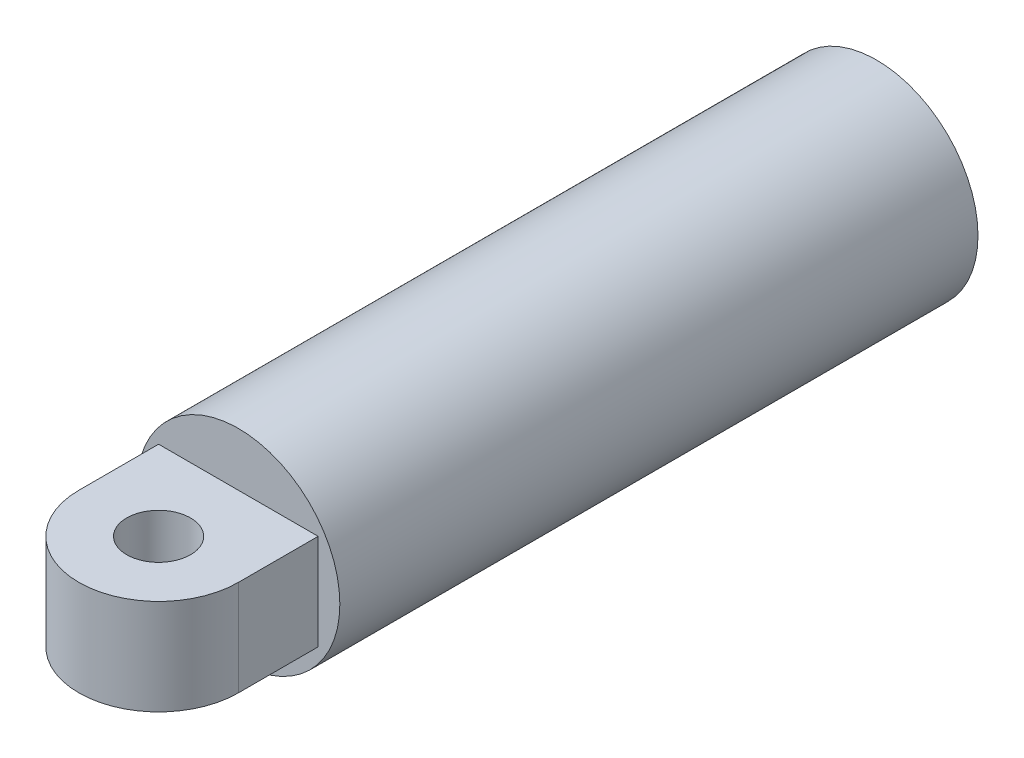
ISO-10303-21;
HEADER;
FILE_DESCRIPTION(('STEP AP214'),'2;1');
FILE_NAME('part.step','',(''),(''),'','','');
FILE_SCHEMA(('AUTOMOTIVE_DESIGN { 1 0 10303 214 1 1 1 1 }'));
ENDSEC;
DATA;
#1=APPLICATION_CONTEXT('core data for automotive mechanical design processes');
#2=APPLICATION_PROTOCOL_DEFINITION('international standard','automotive_design',2000,#1);
#3=PRODUCT_CONTEXT('',#1,'mechanical');
#4=PRODUCT('Part','Part','',(#3));
#5=PRODUCT_RELATED_PRODUCT_CATEGORY('part','',(#4));
#6=PRODUCT_DEFINITION_FORMATION('','',#4);
#7=PRODUCT_DEFINITION_CONTEXT('part definition',#1,'design');
#8=PRODUCT_DEFINITION('design','',#6,#7);
#9=PRODUCT_DEFINITION_SHAPE('','',#8);
#10=(LENGTH_UNIT() NAMED_UNIT(*) SI_UNIT(.MILLI.,.METRE.));
#11=(NAMED_UNIT(*) PLANE_ANGLE_UNIT() SI_UNIT($,.RADIAN.));
#12=(NAMED_UNIT(*) SI_UNIT($,.STERADIAN.) SOLID_ANGLE_UNIT());
#13=UNCERTAINTY_MEASURE_WITH_UNIT(LENGTH_MEASURE(1.E-05),#10,'distance_accuracy_value','');
#14=(GEOMETRIC_REPRESENTATION_CONTEXT(3) GLOBAL_UNCERTAINTY_ASSIGNED_CONTEXT((#13)) GLOBAL_UNIT_ASSIGNED_CONTEXT((#10,
#11,#12)) REPRESENTATION_CONTEXT('',''));
#15=CARTESIAN_POINT('',(0.,0.,0.));
#16=DIRECTION('',(0.,0.,1.));
#17=DIRECTION('',(1.,0.,0.));
#18=AXIS2_PLACEMENT_3D('',#15,#16,#17);
#19=CARTESIAN_POINT('',(12.5,7.5,125.));
#20=DIRECTION('',(-1.,0.,0.));
#21=DIRECTION('',(0.,0.,1.));
#22=AXIS2_PLACEMENT_3D('',#19,#20,#21);
#23=PLANE('',#22);
#24=DIRECTION('',(0.,-1.,0.));
#25=VECTOR('',#24,1.);
#26=CARTESIAN_POINT('',(12.5,15.9,112.5));
#27=LINE('',#26,#25);
#28=CARTESIAN_POINT('',(12.5,7.5,112.5));
#29=VERTEX_POINT('',#28);
#30=CARTESIAN_POINT('',(12.5,-7.5,112.5));
#31=VERTEX_POINT('',#30);
#32=EDGE_CURVE('E77',#29,#31,#27,.T.);
#33=ORIENTED_EDGE('',*,*,#32,.T.);
#34=DIRECTION('',(0.,0.,-1.));
#35=VECTOR('',#34,1.);
#36=CARTESIAN_POINT('',(12.5,-7.5,125.));
#37=LINE('',#36,#35);
#38=CARTESIAN_POINT('',(12.5,-7.5,100.));
#39=VERTEX_POINT('',#38);
#40=EDGE_CURVE('E56',#31,#39,#37,.T.);
#41=ORIENTED_EDGE('',*,*,#40,.T.);
#42=DIRECTION('',(0.,1.,0.));
#43=VECTOR('',#42,1.);
#44=CARTESIAN_POINT('',(12.5,7.5,100.));
#45=LINE('',#44,#43);
#46=CARTESIAN_POINT('',(12.5,7.5,100.));
#47=VERTEX_POINT('',#46);
#48=EDGE_CURVE('E142',#39,#47,#45,.T.);
#49=ORIENTED_EDGE('',*,*,#48,.T.);
#50=DIRECTION('',(0.,0.,-1.));
#51=VECTOR('',#50,1.);
#52=CARTESIAN_POINT('',(12.5,7.5,125.));
#53=LINE('',#52,#51);
#54=EDGE_CURVE('E94',#29,#47,#53,.T.);
#55=ORIENTED_EDGE('',*,*,#54,.F.);
#56=EDGE_LOOP('',(#33,#41,#49,#55));
#57=FACE_BOUND('',#56,.T.);
#58=ADVANCED_FACE('F33',(#57),#23,.F.);
#59=CARTESIAN_POINT('',(-12.5,7.5,125.));
#60=DIRECTION('',(0.,-1.,0.));
#61=DIRECTION('',(1.,0.,0.));
#62=AXIS2_PLACEMENT_3D('',#59,#60,#61);
#63=PLANE('',#62);
#64=CARTESIAN_POINT('',(0.,7.5,112.5));
#65=DIRECTION('',(0.,-1.,0.));
#66=DIRECTION('',(1.,0.,0.));
#67=AXIS2_PLACEMENT_3D('',#64,#65,#66);
#68=CIRCLE('',#67,5.00000000000001);
#69=CARTESIAN_POINT('',(5.00000000000001,7.5,112.5));
#70=VERTEX_POINT('',#69);
#71=EDGE_CURVE('E145',#70,#70,#68,.F.);
#72=ORIENTED_EDGE('',*,*,#71,.F.);
#73=EDGE_LOOP('',(#72));
#74=FACE_BOUND('',#73,.T.);
#75=CARTESIAN_POINT('',(0.,7.5,112.5));
#76=DIRECTION('',(0.,-1.,0.));
#77=DIRECTION('',(1.,0.,0.));
#78=AXIS2_PLACEMENT_3D('',#75,#76,#77);
#79=CIRCLE('',#78,12.5);
#80=CARTESIAN_POINT('',(-12.5,7.5,112.5));
#81=VERTEX_POINT('',#80);
#82=EDGE_CURVE('E84',#29,#81,#79,.T.);
#83=ORIENTED_EDGE('',*,*,#82,.F.);
#84=ORIENTED_EDGE('',*,*,#54,.T.);
#85=DIRECTION('',(-1.,0.,0.));
#86=VECTOR('',#85,1.);
#87=CARTESIAN_POINT('',(-12.5,7.5,100.));
#88=LINE('',#87,#86);
#89=CARTESIAN_POINT('',(-12.5,7.5,100.));
#90=VERTEX_POINT('',#89);
#91=EDGE_CURVE('E141',#47,#90,#88,.T.);
#92=ORIENTED_EDGE('',*,*,#91,.T.);
#93=DIRECTION('',(0.,0.,-1.));
#94=VECTOR('',#93,1.);
#95=CARTESIAN_POINT('',(-12.5,7.5,125.));
#96=LINE('',#95,#94);
#97=EDGE_CURVE('E92',#81,#90,#96,.T.);
#98=ORIENTED_EDGE('',*,*,#97,.F.);
#99=EDGE_LOOP('',(#83,#84,#92,#98));
#100=FACE_BOUND('',#99,.T.);
#101=ADVANCED_FACE('F122',(#74,#100),#63,.F.);
#102=CARTESIAN_POINT('',(-12.5,7.5,125.));
#103=DIRECTION('',(1.,0.,0.));
#104=DIRECTION('',(0.,0.,-1.));
#105=AXIS2_PLACEMENT_3D('',#102,#103,#104);
#106=PLANE('',#105);
#107=DIRECTION('',(0.,-1.,0.));
#108=VECTOR('',#107,1.);
#109=CARTESIAN_POINT('',(-12.5,15.9,112.5));
#110=LINE('',#109,#108);
#111=CARTESIAN_POINT('',(-12.5,-7.5,112.5));
#112=VERTEX_POINT('',#111);
#113=EDGE_CURVE('E81',#81,#112,#110,.T.);
#114=ORIENTED_EDGE('',*,*,#113,.F.);
#115=ORIENTED_EDGE('',*,*,#97,.T.);
#116=DIRECTION('',(0.,-1.,0.));
#117=VECTOR('',#116,1.);
#118=CARTESIAN_POINT('',(-12.5,7.5,100.));
#119=LINE('',#118,#117);
#120=CARTESIAN_POINT('',(-12.5,-7.5,100.));
#121=VERTEX_POINT('',#120);
#122=EDGE_CURVE('E90',#90,#121,#119,.T.);
#123=ORIENTED_EDGE('',*,*,#122,.T.);
#124=DIRECTION('',(0.,0.,-1.));
#125=VECTOR('',#124,1.);
#126=CARTESIAN_POINT('',(-12.5,-7.5,125.));
#127=LINE('',#126,#125);
#128=EDGE_CURVE('E48',#112,#121,#127,.T.);
#129=ORIENTED_EDGE('',*,*,#128,.F.);
#130=EDGE_LOOP('',(#114,#115,#123,#129));
#131=FACE_BOUND('',#130,.T.);
#132=ADVANCED_FACE('F88',(#131),#106,.F.);
#133=CARTESIAN_POINT('',(-12.5,-7.5,125.));
#134=DIRECTION('',(0.,1.,0.));
#135=DIRECTION('',(-1.,0.,0.));
#136=AXIS2_PLACEMENT_3D('',#133,#134,#135);
#137=PLANE('',#136);
#138=CARTESIAN_POINT('',(0.,-7.5,112.5));
#139=DIRECTION('',(0.,1.,0.));
#140=DIRECTION('',(-1.,0.,0.));
#141=AXIS2_PLACEMENT_3D('',#138,#139,#140);
#142=CIRCLE('',#141,5.00000000000001);
#143=CARTESIAN_POINT('',(-5.00000000000001,-7.5,112.5));
#144=VERTEX_POINT('',#143);
#145=EDGE_CURVE('E150',#144,#144,#142,.T.);
#146=ORIENTED_EDGE('',*,*,#145,.T.);
#147=EDGE_LOOP('',(#146));
#148=FACE_BOUND('',#147,.T.);
#149=CARTESIAN_POINT('',(0.,-7.5,112.5));
#150=DIRECTION('',(0.,-1.,0.));
#151=DIRECTION('',(-1.,0.,0.));
#152=AXIS2_PLACEMENT_3D('',#149,#150,#151);
#153=CIRCLE('',#152,12.5);
#154=EDGE_CURVE('E73',#31,#112,#153,.T.);
#155=ORIENTED_EDGE('',*,*,#154,.T.);
#156=ORIENTED_EDGE('',*,*,#128,.T.);
#157=DIRECTION('',(1.,0.,0.));
#158=VECTOR('',#157,1.);
#159=CARTESIAN_POINT('',(-12.5,-7.5,100.));
#160=LINE('',#159,#158);
#161=EDGE_CURVE('E96',#121,#39,#160,.T.);
#162=ORIENTED_EDGE('',*,*,#161,.T.);
#163=ORIENTED_EDGE('',*,*,#40,.F.);
#164=EDGE_LOOP('',(#155,#156,#162,#163));
#165=FACE_BOUND('',#164,.T.);
#166=ADVANCED_FACE('F75',(#148,#165),#137,.F.);
#167=CARTESIAN_POINT('',(0.,0.,100.));
#168=DIRECTION('',(0.,0.,1.));
#169=DIRECTION('',(1.,0.,0.));
#170=AXIS2_PLACEMENT_3D('',#167,#168,#169);
#171=PLANE('',#170);
#172=CARTESIAN_POINT('',(0.,0.,100.));
#173=DIRECTION('',(0.,0.,1.));
#174=DIRECTION('',(1.,0.,0.));
#175=AXIS2_PLACEMENT_3D('',#172,#173,#174);
#176=CIRCLE('',#175,15.9);
#177=CARTESIAN_POINT('',(15.9,0.,100.));
#178=VERTEX_POINT('',#177);
#179=EDGE_CURVE('E11',#178,#178,#176,.T.);
#180=ORIENTED_EDGE('',*,*,#179,.T.);
#181=EDGE_LOOP('',(#180));
#182=FACE_BOUND('',#181,.T.);
#183=ORIENTED_EDGE('',*,*,#91,.F.);
#184=ORIENTED_EDGE('',*,*,#48,.F.);
#185=ORIENTED_EDGE('',*,*,#161,.F.);
#186=ORIENTED_EDGE('',*,*,#122,.F.);
#187=EDGE_LOOP('',(#183,#184,#185,#186));
#188=FACE_BOUND('',#187,.T.);
#189=ADVANCED_FACE('F117',(#182,#188),#171,.T.);
#190=CARTESIAN_POINT('',(0.,0.,100.));
#191=DIRECTION('',(0.,0.,-1.));
#192=DIRECTION('',(-1.,0.,0.));
#193=AXIS2_PLACEMENT_3D('',#190,#191,#192);
#194=CYLINDRICAL_SURFACE('',#193,15.9);
#195=ORIENTED_EDGE('',*,*,#179,.F.);
#196=EDGE_LOOP('',(#195));
#197=FACE_BOUND('',#196,.T.);
#198=CARTESIAN_POINT('',(0.,0.,0.));
#199=DIRECTION('',(0.,0.,1.));
#200=DIRECTION('',(1.,0.,0.));
#201=AXIS2_PLACEMENT_3D('',#198,#199,#200);
#202=CIRCLE('',#201,15.9);
#203=CARTESIAN_POINT('',(15.9,0.,0.));
#204=VERTEX_POINT('',#203);
#205=EDGE_CURVE('E37',#204,#204,#202,.T.);
#206=ORIENTED_EDGE('',*,*,#205,.T.);
#207=EDGE_LOOP('',(#206));
#208=FACE_BOUND('',#207,.T.);
#209=ADVANCED_FACE('F35',(#197,#208),#194,.T.);
#210=CARTESIAN_POINT('',(0.,0.,0.));
#211=DIRECTION('',(0.,0.,1.));
#212=DIRECTION('',(1.,0.,0.));
#213=AXIS2_PLACEMENT_3D('',#210,#211,#212);
#214=PLANE('',#213);
#215=CARTESIAN_POINT('',(0.,0.,0.));
#216=DIRECTION('',(0.,0.,-1.));
#217=DIRECTION('',(-1.,0.,0.));
#218=AXIS2_PLACEMENT_3D('',#215,#216,#217);
#219=CIRCLE('',#218,14.);
#220=CARTESIAN_POINT('',(-14.,0.,0.));
#221=VERTEX_POINT('',#220);
#222=EDGE_CURVE('E155',#221,#221,#219,.T.);
#223=ORIENTED_EDGE('',*,*,#222,.F.);
#224=EDGE_LOOP('',(#223));
#225=FACE_BOUND('',#224,.T.);
#226=ORIENTED_EDGE('',*,*,#205,.F.);
#227=EDGE_LOOP('',(#226));
#228=FACE_BOUND('',#227,.T.);
#229=ADVANCED_FACE('F107',(#225,#228),#214,.F.);
#230=CARTESIAN_POINT('',(0.,15.9,112.5));
#231=DIRECTION('',(0.,-1.,0.));
#232=DIRECTION('',(1.,0.,0.));
#233=AXIS2_PLACEMENT_3D('',#230,#231,#232);
#234=CYLINDRICAL_SURFACE('',#233,5.00000000000001);
#235=ORIENTED_EDGE('',*,*,#145,.F.);
#236=EDGE_LOOP('',(#235));
#237=FACE_BOUND('',#236,.T.);
#238=ORIENTED_EDGE('',*,*,#71,.T.);
#239=EDGE_LOOP('',(#238));
#240=FACE_BOUND('',#239,.T.);
#241=ADVANCED_FACE('F109',(#237,#240),#234,.F.);
#242=CARTESIAN_POINT('',(0.,15.9,112.5));
#243=DIRECTION('',(0.,-1.,0.));
#244=DIRECTION('',(1.,0.,0.));
#245=AXIS2_PLACEMENT_3D('',#242,#243,#244);
#246=CYLINDRICAL_SURFACE('',#245,12.5);
#247=ORIENTED_EDGE('',*,*,#82,.T.);
#248=ORIENTED_EDGE('',*,*,#113,.T.);
#249=ORIENTED_EDGE('',*,*,#154,.F.);
#250=ORIENTED_EDGE('',*,*,#32,.F.);
#251=EDGE_LOOP('',(#247,#248,#249,#250));
#252=FACE_BOUND('',#251,.T.);
#253=ADVANCED_FACE('F82',(#252),#246,.T.);
#254=CARTESIAN_POINT('',(0.,0.,52.));
#255=DIRECTION('',(0.,0.,-1.));
#256=DIRECTION('',(-1.,0.,0.));
#257=AXIS2_PLACEMENT_3D('',#254,#255,#256);
#258=CYLINDRICAL_SURFACE('',#257,14.);
#259=CARTESIAN_POINT('',(0.,0.,52.));
#260=DIRECTION('',(0.,0.,-1.));
#261=DIRECTION('',(-1.,0.,0.));
#262=AXIS2_PLACEMENT_3D('',#259,#260,#261);
#263=CIRCLE('',#262,14.);
#264=CARTESIAN_POINT('',(-14.,0.,52.));
#265=VERTEX_POINT('',#264);
#266=EDGE_CURVE('E78',#265,#265,#263,.T.);
#267=CARTESIAN_POINT('',(-14.,0.,52.));
#268=CARTESIAN_POINT('',(-14.,0.,51.4583333333334));
#269=CARTESIAN_POINT('',(-14.,0.,50.9166666666667));
#270=CARTESIAN_POINT('',(-14.,0.,49.8333333333334));
#271=CARTESIAN_POINT('',(-14.,0.,49.2916666666667));
#272=CARTESIAN_POINT('',(-14.,0.,48.2083333333333));
#273=CARTESIAN_POINT('',(-14.,0.,47.6666666666667));
#274=CARTESIAN_POINT('',(-14.,0.,46.5833333333333));
#275=CARTESIAN_POINT('',(-14.,0.,46.0416666666667));
#276=CARTESIAN_POINT('',(-14.,0.,44.9583333333333));
#277=CARTESIAN_POINT('',(-14.,0.,44.4166666666667));
#278=CARTESIAN_POINT('',(-14.,0.,43.3333333333334));
#279=CARTESIAN_POINT('',(-14.,0.,42.7916666666667));
#280=CARTESIAN_POINT('',(-14.,0.,41.7083333333334));
#281=CARTESIAN_POINT('',(-14.,0.,41.1666666666667));
#282=CARTESIAN_POINT('',(-14.,0.,40.0833333333333));
#283=CARTESIAN_POINT('',(-14.,0.,39.5416666666667));
#284=CARTESIAN_POINT('',(-14.,0.,38.4583333333333));
#285=CARTESIAN_POINT('',(-14.,0.,37.9166666666667));
#286=CARTESIAN_POINT('',(-14.,0.,36.8333333333333));
#287=CARTESIAN_POINT('',(-14.,0.,36.2916666666667));
#288=CARTESIAN_POINT('',(-14.,0.,35.2083333333333));
#289=CARTESIAN_POINT('',(-14.,0.,34.6666666666667));
#290=CARTESIAN_POINT('',(-14.,0.,33.5833333333333));
#291=CARTESIAN_POINT('',(-14.,0.,33.0416666666667));
#292=CARTESIAN_POINT('',(-14.,0.,31.9583333333334));
#293=CARTESIAN_POINT('',(-14.,0.,31.4166666666667));
#294=CARTESIAN_POINT('',(-14.,0.,30.3333333333333));
#295=CARTESIAN_POINT('',(-14.,0.,29.7916666666667));
#296=CARTESIAN_POINT('',(-14.,0.,28.7083333333334));
#297=CARTESIAN_POINT('',(-14.,0.,28.1666666666667));
#298=CARTESIAN_POINT('',(-14.,0.,27.0833333333333));
#299=CARTESIAN_POINT('',(-14.,0.,26.5416666666667));
#300=CARTESIAN_POINT('',(-14.,0.,25.4583333333333));
#301=CARTESIAN_POINT('',(-14.,0.,24.9166666666667));
#302=CARTESIAN_POINT('',(-14.,0.,23.8333333333333));
#303=CARTESIAN_POINT('',(-14.,0.,23.2916666666667));
#304=CARTESIAN_POINT('',(-14.,0.,22.2083333333333));
#305=CARTESIAN_POINT('',(-14.,0.,21.6666666666667));
#306=CARTESIAN_POINT('',(-14.,0.,20.5833333333333));
#307=CARTESIAN_POINT('',(-14.,0.,20.0416666666667));
#308=CARTESIAN_POINT('',(-14.,0.,18.9583333333333));
#309=CARTESIAN_POINT('',(-14.,0.,18.4166666666667));
#310=CARTESIAN_POINT('',(-14.,0.,17.3333333333333));
#311=CARTESIAN_POINT('',(-14.,0.,16.7916666666667));
#312=CARTESIAN_POINT('',(-14.,0.,15.7083333333333));
#313=CARTESIAN_POINT('',(-14.,0.,15.1666666666667));
#314=CARTESIAN_POINT('',(-14.,0.,14.0833333333333));
#315=CARTESIAN_POINT('',(-14.,0.,13.5416666666667));
#316=CARTESIAN_POINT('',(-14.,0.,12.4583333333333));
#317=CARTESIAN_POINT('',(-14.,0.,11.9166666666667));
#318=CARTESIAN_POINT('',(-14.,0.,10.8333333333333));
#319=CARTESIAN_POINT('',(-14.,0.,10.2916666666667));
#320=CARTESIAN_POINT('',(-14.,0.,9.20833333333334));
#321=CARTESIAN_POINT('',(-14.,0.,8.66666666666667));
#322=CARTESIAN_POINT('',(-14.,0.,7.58333333333334));
#323=CARTESIAN_POINT('',(-14.,0.,7.04166666666668));
#324=CARTESIAN_POINT('',(-14.,0.,5.95833333333335));
#325=CARTESIAN_POINT('',(-14.,0.,5.41666666666668));
#326=CARTESIAN_POINT('',(-14.,0.,4.33333333333334));
#327=CARTESIAN_POINT('',(-14.,0.,3.79166666666668));
#328=CARTESIAN_POINT('',(-14.,0.,2.70833333333334));
#329=CARTESIAN_POINT('',(-14.,0.,2.16666666666668));
#330=CARTESIAN_POINT('',(-14.,0.,1.08333333333334));
#331=CARTESIAN_POINT('',(-14.,0.,0.541666666666674));
#332=CARTESIAN_POINT('',(-14.,0.,0.));
#333=B_SPLINE_CURVE_WITH_KNOTS('',3,(#267,#268,#269,#270,#271,#272,#273,#274,#275,#276,#277,
#278,#279,#280,#281,#282,#283,#284,#285,#286,#287,#288,#289,#290,#291,#292,#293,#294,#295,#296,
#297,#298,#299,#300,#301,#302,#303,#304,#305,#306,#307,#308,#309,#310,#311,#312,#313,#314,#315,
#316,#317,#318,#319,#320,#321,#322,#323,#324,#325,#326,#327,#328,#329,#330,#331,#332),
.UNSPECIFIED.,.F.,.F.,(4,2,2,2,2,2,2,2,2,2,2,2,2,2,2,2,2,2,2,2,2,2,2,2,2,2,2,2,2,2,2,2,4),(0.,
1.62499999999999,3.25,4.875,6.5,8.125,9.74999999999999,11.375,13.,14.625,16.25,17.875,19.5,
21.125,22.75,24.375,26.,27.625,29.25,30.875,32.5,34.125,35.75,37.375,39.,40.625,42.25,43.875,
45.5,47.125,48.75,50.375,52.),.UNSPECIFIED.);
#334=EDGE_CURVE('BSEAM163',#265,#221,#333,.T.);
#335=ORIENTED_EDGE('',*,*,#266,.F.);
#336=ORIENTED_EDGE('',*,*,#222,.T.);
#337=ORIENTED_EDGE('',*,*,#334,.T.);
#338=ORIENTED_EDGE('',*,*,#334,.F.);
#339=EDGE_LOOP('',(#335,#337,#336,#338));
#340=FACE_BOUND('',#339,.T.);
#341=ADVANCED_FACE('F163',(#340),#258,.F.);
#342=CARTESIAN_POINT('',(0.,0.,52.));
#343=DIRECTION('',(0.,0.,-1.));
#344=DIRECTION('',(-1.,0.,0.));
#345=AXIS2_PLACEMENT_3D('',#342,#343,#344);
#346=PLANE('',#345);
#347=ORIENTED_EDGE('',*,*,#266,.T.);
#348=EDGE_LOOP('',(#347));
#349=FACE_BOUND('',#348,.T.);
#350=ADVANCED_FACE('F161',(#349),#346,.T.);
#351=CLOSED_SHELL('',(#58,#101,#132,#166,#189,#209,#229,#241,#253,#341,#350));
#352=MANIFOLD_SOLID_BREP('B2',#351);
#353=ADVANCED_BREP_SHAPE_REPRESENTATION('',(#18,#352),#14);
#354=SHAPE_DEFINITION_REPRESENTATION(#9,#353);
ENDSEC;
END-ISO-10303-21;
